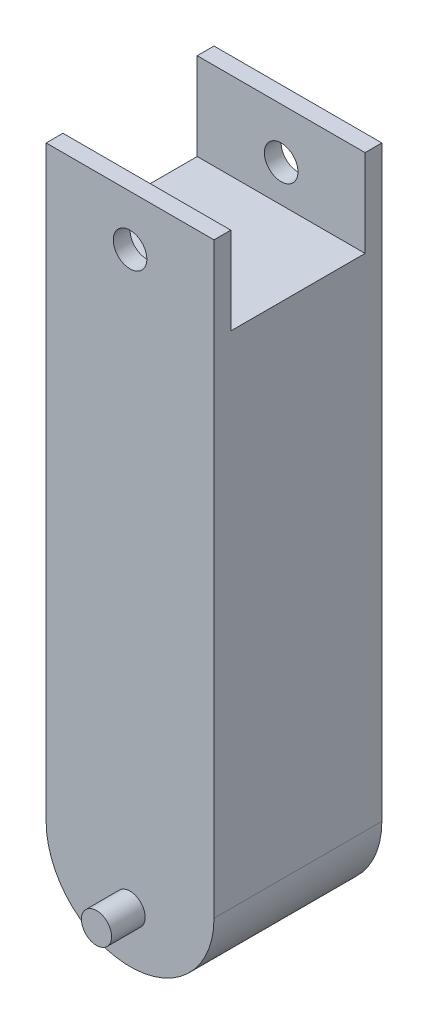
ISO-10303-21;
HEADER;
FILE_DESCRIPTION(('STEP AP214'),'2;1');
FILE_NAME('part.step','',(''),(''),'','','');
FILE_SCHEMA(('AUTOMOTIVE_DESIGN { 1 0 10303 214 1 1 1 1 }'));
ENDSEC;
DATA;
#1=APPLICATION_CONTEXT('core data for automotive mechanical design processes');
#2=APPLICATION_PROTOCOL_DEFINITION('international standard','automotive_design',2000,#1);
#3=PRODUCT_CONTEXT('',#1,'mechanical');
#4=PRODUCT('Part','Part','',(#3));
#5=PRODUCT_RELATED_PRODUCT_CATEGORY('part','',(#4));
#6=PRODUCT_DEFINITION_FORMATION('','',#4);
#7=PRODUCT_DEFINITION_CONTEXT('part definition',#1,'design');
#8=PRODUCT_DEFINITION('design','',#6,#7);
#9=PRODUCT_DEFINITION_SHAPE('','',#8);
#10=(LENGTH_UNIT() NAMED_UNIT(*) SI_UNIT(.MILLI.,.METRE.));
#11=(NAMED_UNIT(*) PLANE_ANGLE_UNIT() SI_UNIT($,.RADIAN.));
#12=(NAMED_UNIT(*) SI_UNIT($,.STERADIAN.) SOLID_ANGLE_UNIT());
#13=UNCERTAINTY_MEASURE_WITH_UNIT(LENGTH_MEASURE(1.E-05),#10,'distance_accuracy_value','');
#14=(GEOMETRIC_REPRESENTATION_CONTEXT(3) GLOBAL_UNCERTAINTY_ASSIGNED_CONTEXT((#13)) GLOBAL_UNIT_ASSIGNED_CONTEXT((#10,
#11,#12)) REPRESENTATION_CONTEXT('',''));
#15=CARTESIAN_POINT('',(0.,0.,0.));
#16=DIRECTION('',(0.,0.,1.));
#17=DIRECTION('',(1.,0.,0.));
#18=AXIS2_PLACEMENT_3D('',#15,#16,#17);
#19=CARTESIAN_POINT('',(0.,0.,63.5));
#20=DIRECTION('',(1.,0.,0.));
#21=DIRECTION('',(0.,0.,-1.));
#22=AXIS2_PLACEMENT_3D('',#19,#20,#21);
#23=PLANE('',#22);
#24=DIRECTION('',(0.,-1.,0.));
#25=VECTOR('',#24,1.);
#26=CARTESIAN_POINT('',(0.,0.,6.34999999999999));
#27=LINE('',#26,#25);
#28=CARTESIAN_POINT('',(0.,254.,6.34999999999999));
#29=VERTEX_POINT('',#28);
#30=CARTESIAN_POINT('',(0.,220.98,6.34999999999999));
#31=VERTEX_POINT('',#30);
#32=EDGE_CURVE('E112',#29,#31,#27,.T.);
#33=ORIENTED_EDGE('',*,*,#32,.F.);
#34=DIRECTION('',(0.,0.,-1.));
#35=VECTOR('',#34,1.);
#36=CARTESIAN_POINT('',(0.,254.,63.5));
#37=LINE('',#36,#35);
#38=CARTESIAN_POINT('',(0.,254.,0.));
#39=VERTEX_POINT('',#38);
#40=EDGE_CURVE('E152',#29,#39,#37,.T.);
#41=ORIENTED_EDGE('',*,*,#40,.T.);
#42=DIRECTION('',(0.,-1.,0.));
#43=VECTOR('',#42,1.);
#44=CARTESIAN_POINT('',(0.,0.,0.));
#45=LINE('',#44,#43);
#46=CARTESIAN_POINT('',(0.,31.75,0.));
#47=VERTEX_POINT('',#46);
#48=EDGE_CURVE('E143',#39,#47,#45,.T.);
#49=ORIENTED_EDGE('',*,*,#48,.T.);
#50=DIRECTION('',(0.,0.,-1.));
#51=VECTOR('',#50,1.);
#52=CARTESIAN_POINT('',(0.,31.75,63.5));
#53=LINE('',#52,#51);
#54=CARTESIAN_POINT('',(0.,31.75,63.5));
#55=VERTEX_POINT('',#54);
#56=EDGE_CURVE('E168',#47,#55,#53,.F.);
#57=ORIENTED_EDGE('',*,*,#56,.T.);
#58=DIRECTION('',(0.,-1.,0.));
#59=VECTOR('',#58,1.);
#60=CARTESIAN_POINT('',(0.,0.,63.5));
#61=LINE('',#60,#59);
#62=CARTESIAN_POINT('',(0.,254.,63.5));
#63=VERTEX_POINT('',#62);
#64=EDGE_CURVE('E144',#63,#55,#61,.T.);
#65=ORIENTED_EDGE('',*,*,#64,.F.);
#66=CARTESIAN_POINT('',(0.,254.,57.15));
#67=VERTEX_POINT('',#66);
#68=EDGE_CURVE('E121',#63,#67,#37,.T.);
#69=ORIENTED_EDGE('',*,*,#68,.T.);
#70=DIRECTION('',(0.,1.,0.));
#71=VECTOR('',#70,1.);
#72=CARTESIAN_POINT('',(0.,0.,57.1500000000001));
#73=LINE('',#72,#71);
#74=CARTESIAN_POINT('',(0.,220.98,57.15));
#75=VERTEX_POINT('',#74);
#76=EDGE_CURVE('E51',#75,#67,#73,.T.);
#77=ORIENTED_EDGE('',*,*,#76,.F.);
#78=DIRECTION('',(0.,0.,1.));
#79=VECTOR('',#78,1.);
#80=CARTESIAN_POINT('',(0.,220.98,63.5));
#81=LINE('',#80,#79);
#82=EDGE_CURVE('E103',#31,#75,#81,.T.);
#83=ORIENTED_EDGE('',*,*,#82,.F.);
#84=EDGE_LOOP('',(#33,#41,#49,#57,#65,#69,#77,#83));
#85=FACE_BOUND('',#84,.T.);
#86=ADVANCED_FACE('F35',(#85),#23,.F.);
#87=CARTESIAN_POINT('',(63.5,0.,63.5));
#88=DIRECTION('',(-1.,0.,0.));
#89=DIRECTION('',(0.,0.,1.));
#90=AXIS2_PLACEMENT_3D('',#87,#88,#89);
#91=PLANE('',#90);
#92=DIRECTION('',(0.,1.,0.));
#93=VECTOR('',#92,1.);
#94=CARTESIAN_POINT('',(63.5,0.,6.34999999999999));
#95=LINE('',#94,#93);
#96=CARTESIAN_POINT('',(63.5,220.98,6.34999999999999));
#97=VERTEX_POINT('',#96);
#98=CARTESIAN_POINT('',(63.5,254.,6.34999999999999));
#99=VERTEX_POINT('',#98);
#100=EDGE_CURVE('E131',#97,#99,#95,.T.);
#101=ORIENTED_EDGE('',*,*,#100,.F.);
#102=DIRECTION('',(0.,0.,-1.));
#103=VECTOR('',#102,1.);
#104=CARTESIAN_POINT('',(63.5,220.98,63.5));
#105=LINE('',#104,#103);
#106=CARTESIAN_POINT('',(63.5,220.98,57.15));
#107=VERTEX_POINT('',#106);
#108=EDGE_CURVE('E11',#107,#97,#105,.T.);
#109=ORIENTED_EDGE('',*,*,#108,.F.);
#110=DIRECTION('',(0.,-1.,0.));
#111=VECTOR('',#110,1.);
#112=CARTESIAN_POINT('',(63.5,0.,57.1500000000001));
#113=LINE('',#112,#111);
#114=CARTESIAN_POINT('',(63.5,254.,57.15));
#115=VERTEX_POINT('',#114);
#116=EDGE_CURVE('E116',#115,#107,#113,.T.);
#117=ORIENTED_EDGE('',*,*,#116,.F.);
#118=DIRECTION('',(0.,0.,-1.));
#119=VECTOR('',#118,1.);
#120=CARTESIAN_POINT('',(63.5,254.,63.5));
#121=LINE('',#120,#119);
#122=CARTESIAN_POINT('',(63.5,254.,63.5));
#123=VERTEX_POINT('',#122);
#124=EDGE_CURVE('E162',#123,#115,#121,.T.);
#125=ORIENTED_EDGE('',*,*,#124,.F.);
#126=DIRECTION('',(0.,1.,0.));
#127=VECTOR('',#126,1.);
#128=CARTESIAN_POINT('',(63.5,0.,63.5));
#129=LINE('',#128,#127);
#130=CARTESIAN_POINT('',(63.5,31.75,63.5));
#131=VERTEX_POINT('',#130);
#132=EDGE_CURVE('E147',#131,#123,#129,.T.);
#133=ORIENTED_EDGE('',*,*,#132,.F.);
#134=DIRECTION('',(0.,0.,-1.));
#135=VECTOR('',#134,1.);
#136=CARTESIAN_POINT('',(63.5,31.75,63.5));
#137=LINE('',#136,#135);
#138=CARTESIAN_POINT('',(63.5,31.75,0.));
#139=VERTEX_POINT('',#138);
#140=EDGE_CURVE('E165',#131,#139,#137,.T.);
#141=ORIENTED_EDGE('',*,*,#140,.T.);
#142=DIRECTION('',(0.,1.,0.));
#143=VECTOR('',#142,1.);
#144=CARTESIAN_POINT('',(63.5,0.,0.));
#145=LINE('',#144,#143);
#146=CARTESIAN_POINT('',(63.5,254.,0.));
#147=VERTEX_POINT('',#146);
#148=EDGE_CURVE('E155',#139,#147,#145,.T.);
#149=ORIENTED_EDGE('',*,*,#148,.T.);
#150=EDGE_CURVE('E161',#99,#147,#121,.T.);
#151=ORIENTED_EDGE('',*,*,#150,.F.);
#152=EDGE_LOOP('',(#101,#109,#117,#125,#133,#141,#149,#151));
#153=FACE_BOUND('',#152,.T.);
#154=ADVANCED_FACE('F191',(#153),#91,.F.);
#155=CARTESIAN_POINT('',(0.,254.,63.5));
#156=DIRECTION('',(0.,-1.,0.));
#157=DIRECTION('',(0.,0.,-1.));
#158=AXIS2_PLACEMENT_3D('',#155,#156,#157);
#159=PLANE('',#158);
#160=DIRECTION('',(-1.,0.,0.));
#161=VECTOR('',#160,1.);
#162=CARTESIAN_POINT('',(0.,254.,6.34999999999999));
#163=LINE('',#162,#161);
#164=EDGE_CURVE('E125',#99,#29,#163,.T.);
#165=ORIENTED_EDGE('',*,*,#164,.F.);
#166=ORIENTED_EDGE('',*,*,#150,.T.);
#167=DIRECTION('',(-1.,0.,0.));
#168=VECTOR('',#167,1.);
#169=CARTESIAN_POINT('',(0.,254.,0.));
#170=LINE('',#169,#168);
#171=EDGE_CURVE('E148',#147,#39,#170,.T.);
#172=ORIENTED_EDGE('',*,*,#171,.T.);
#173=ORIENTED_EDGE('',*,*,#40,.F.);
#174=EDGE_LOOP('',(#165,#166,#172,#173));
#175=FACE_BOUND('',#174,.T.);
#176=ADVANCED_FACE('F195',(#175),#159,.F.);
#177=DIRECTION('',(1.,0.,0.));
#178=VECTOR('',#177,1.);
#179=CARTESIAN_POINT('',(0.,254.,57.15));
#180=LINE('',#179,#178);
#181=EDGE_CURVE('E126',#67,#115,#180,.T.);
#182=ORIENTED_EDGE('',*,*,#181,.F.);
#183=ORIENTED_EDGE('',*,*,#68,.F.);
#184=DIRECTION('',(-1.,0.,0.));
#185=VECTOR('',#184,1.);
#186=CARTESIAN_POINT('',(0.,254.,63.5));
#187=LINE('',#186,#185);
#188=EDGE_CURVE('E150',#123,#63,#187,.T.);
#189=ORIENTED_EDGE('',*,*,#188,.F.);
#190=ORIENTED_EDGE('',*,*,#124,.T.);
#191=EDGE_LOOP('',(#182,#183,#189,#190));
#192=FACE_BOUND('',#191,.T.);
#193=ADVANCED_FACE('F221',(#192),#159,.F.);
#194=CARTESIAN_POINT('',(31.75,234.95,116.586));
#195=DIRECTION('',(0.,0.,-1.));
#196=DIRECTION('',(-1.,0.,0.));
#197=AXIS2_PLACEMENT_3D('',#194,#195,#196);
#198=CYLINDRICAL_SURFACE('',#197,6.35);
#199=CARTESIAN_POINT('',(31.75,234.95,0.));
#200=DIRECTION('',(0.,0.,-1.));
#201=DIRECTION('',(-1.,0.,0.));
#202=AXIS2_PLACEMENT_3D('',#199,#200,#201);
#203=CIRCLE('',#202,6.35);
#204=CARTESIAN_POINT('',(25.4,234.95,0.));
#205=VERTEX_POINT('',#204);
#206=EDGE_CURVE('E111',#205,#205,#203,.F.);
#207=ORIENTED_EDGE('',*,*,#206,.F.);
#208=EDGE_LOOP('',(#207));
#209=FACE_BOUND('',#208,.T.);
#210=CARTESIAN_POINT('',(31.75,234.95,6.34999999999999));
#211=DIRECTION('',(0.,0.,1.));
#212=DIRECTION('',(1.,0.,0.));
#213=AXIS2_PLACEMENT_3D('',#210,#211,#212);
#214=CIRCLE('',#213,6.35);
#215=CARTESIAN_POINT('',(38.1,234.95,6.34999999999999));
#216=VERTEX_POINT('',#215);
#217=EDGE_CURVE('E122',#216,#216,#214,.T.);
#218=ORIENTED_EDGE('',*,*,#217,.T.);
#219=EDGE_LOOP('',(#218));
#220=FACE_BOUND('',#219,.T.);
#221=ADVANCED_FACE('F210',(#209,#220),#198,.F.);
#222=CARTESIAN_POINT('',(31.75,234.95,63.5));
#223=DIRECTION('',(0.,0.,-1.));
#224=DIRECTION('',(-1.,0.,0.));
#225=AXIS2_PLACEMENT_3D('',#222,#223,#224);
#226=CIRCLE('',#225,6.35);
#227=CARTESIAN_POINT('',(25.4,234.95,63.5));
#228=VERTEX_POINT('',#227);
#229=EDGE_CURVE('E134',#228,#228,#226,.F.);
#230=ORIENTED_EDGE('',*,*,#229,.T.);
#231=EDGE_LOOP('',(#230));
#232=FACE_BOUND('',#231,.T.);
#233=CARTESIAN_POINT('',(31.75,234.95,57.15));
#234=DIRECTION('',(0.,0.,-1.));
#235=DIRECTION('',(0.,1.,0.));
#236=AXIS2_PLACEMENT_3D('',#233,#234,#235);
#237=CIRCLE('',#236,6.35);
#238=CARTESIAN_POINT('',(31.75,241.3,57.15));
#239=VERTEX_POINT('',#238);
#240=EDGE_CURVE('E180',#239,#239,#237,.T.);
#241=ORIENTED_EDGE('',*,*,#240,.T.);
#242=EDGE_LOOP('',(#241));
#243=FACE_BOUND('',#242,.T.);
#244=ADVANCED_FACE('F203',(#232,#243),#198,.F.);
#245=CARTESIAN_POINT('',(31.75,31.75,63.5));
#246=DIRECTION('',(0.,0.,-1.));
#247=DIRECTION('',(-1.,0.,0.));
#248=AXIS2_PLACEMENT_3D('',#245,#246,#247);
#249=CYLINDRICAL_SURFACE('',#248,31.75);
#250=ORIENTED_EDGE('',*,*,#140,.F.);
#251=CARTESIAN_POINT('',(31.75,31.75,63.5));
#252=DIRECTION('',(0.,0.,-1.));
#253=DIRECTION('',(-1.,0.,0.));
#254=AXIS2_PLACEMENT_3D('',#251,#252,#253);
#255=CIRCLE('',#254,31.75);
#256=EDGE_CURVE('E59',#55,#131,#255,.F.);
#257=ORIENTED_EDGE('',*,*,#256,.F.);
#258=ORIENTED_EDGE('',*,*,#56,.F.);
#259=CARTESIAN_POINT('',(31.75,31.75,0.));
#260=DIRECTION('',(0.,0.,-1.));
#261=DIRECTION('',(-1.,0.,0.));
#262=AXIS2_PLACEMENT_3D('',#259,#260,#261);
#263=CIRCLE('',#262,31.75);
#264=EDGE_CURVE('E171',#139,#47,#263,.T.);
#265=ORIENTED_EDGE('',*,*,#264,.F.);
#266=EDGE_LOOP('',(#250,#257,#258,#265));
#267=FACE_BOUND('',#266,.T.);
#268=ADVANCED_FACE('F38',(#267),#249,.T.);
#269=CARTESIAN_POINT('',(0.,0.,63.5));
#270=DIRECTION('',(0.,0.,-1.));
#271=DIRECTION('',(-1.,0.,0.));
#272=AXIS2_PLACEMENT_3D('',#269,#270,#271);
#273=PLANE('',#272);
#274=ORIENTED_EDGE('',*,*,#229,.F.);
#275=EDGE_LOOP('',(#274));
#276=FACE_BOUND('',#275,.T.);
#277=CARTESIAN_POINT('',(31.75,19.05,63.5));
#278=DIRECTION('',(0.,0.,-1.));
#279=DIRECTION('',(-1.,0.,0.));
#280=AXIS2_PLACEMENT_3D('',#277,#278,#279);
#281=CIRCLE('',#280,5.715);
#282=CARTESIAN_POINT('',(26.035,19.05,63.5));
#283=VERTEX_POINT('',#282);
#284=EDGE_CURVE('E173',#283,#283,#281,.F.);
#285=ORIENTED_EDGE('',*,*,#284,.F.);
#286=EDGE_LOOP('',(#285));
#287=FACE_BOUND('',#286,.T.);
#288=ORIENTED_EDGE('',*,*,#64,.T.);
#289=ORIENTED_EDGE('',*,*,#256,.T.);
#290=ORIENTED_EDGE('',*,*,#132,.T.);
#291=ORIENTED_EDGE('',*,*,#188,.T.);
#292=EDGE_LOOP('',(#288,#289,#290,#291));
#293=FACE_BOUND('',#292,.T.);
#294=ADVANCED_FACE('F202',(#276,#287,#293),#273,.F.);
#295=CARTESIAN_POINT('',(0.,0.,0.));
#296=DIRECTION('',(0.,0.,-1.));
#297=DIRECTION('',(-1.,0.,0.));
#298=AXIS2_PLACEMENT_3D('',#295,#296,#297);
#299=PLANE('',#298);
#300=ORIENTED_EDGE('',*,*,#206,.T.);
#301=EDGE_LOOP('',(#300));
#302=FACE_BOUND('',#301,.T.);
#303=CARTESIAN_POINT('',(31.75,19.05,0.));
#304=DIRECTION('',(0.,0.,-1.));
#305=DIRECTION('',(-1.,0.,0.));
#306=AXIS2_PLACEMENT_3D('',#303,#304,#305);
#307=CIRCLE('',#306,5.715);
#308=CARTESIAN_POINT('',(26.035,19.05,0.));
#309=VERTEX_POINT('',#308);
#310=EDGE_CURVE('E44',#309,#309,#307,.T.);
#311=ORIENTED_EDGE('',*,*,#310,.F.);
#312=EDGE_LOOP('',(#311));
#313=FACE_BOUND('',#312,.T.);
#314=ORIENTED_EDGE('',*,*,#148,.F.);
#315=ORIENTED_EDGE('',*,*,#264,.T.);
#316=ORIENTED_EDGE('',*,*,#48,.F.);
#317=ORIENTED_EDGE('',*,*,#171,.F.);
#318=EDGE_LOOP('',(#314,#315,#316,#317));
#319=FACE_BOUND('',#318,.T.);
#320=ADVANCED_FACE('F199',(#302,#313,#319),#299,.T.);
#321=CARTESIAN_POINT('',(31.75,19.05,76.2));
#322=DIRECTION('',(0.,0.,-1.));
#323=DIRECTION('',(-1.,0.,0.));
#324=AXIS2_PLACEMENT_3D('',#321,#322,#323);
#325=CYLINDRICAL_SURFACE('',#324,5.715);
#326=CARTESIAN_POINT('',(31.75,19.05,76.2));
#327=DIRECTION('',(0.,0.,1.));
#328=DIRECTION('',(1.,0.,0.));
#329=AXIS2_PLACEMENT_3D('',#326,#327,#328);
#330=CIRCLE('',#329,5.715);
#331=CARTESIAN_POINT('',(37.465,19.05,76.2));
#332=VERTEX_POINT('',#331);
#333=EDGE_CURVE('E140',#332,#332,#330,.T.);
#334=ORIENTED_EDGE('',*,*,#333,.F.);
#335=EDGE_LOOP('',(#334));
#336=FACE_BOUND('',#335,.T.);
#337=ORIENTED_EDGE('',*,*,#284,.T.);
#338=EDGE_LOOP('',(#337));
#339=FACE_BOUND('',#338,.T.);
#340=ADVANCED_FACE('F223',(#336,#339),#325,.T.);
#341=CARTESIAN_POINT('',(31.75,19.05,76.2));
#342=DIRECTION('',(0.,0.,1.));
#343=DIRECTION('',(1.,0.,0.));
#344=AXIS2_PLACEMENT_3D('',#341,#342,#343);
#345=PLANE('',#344);
#346=ORIENTED_EDGE('',*,*,#333,.T.);
#347=EDGE_LOOP('',(#346));
#348=FACE_BOUND('',#347,.T.);
#349=ADVANCED_FACE('F228',(#348),#345,.T.);
#350=CARTESIAN_POINT('',(31.75,19.05,-12.7));
#351=DIRECTION('',(0.,0.,1.));
#352=DIRECTION('',(1.,0.,0.));
#353=AXIS2_PLACEMENT_3D('',#350,#351,#352);
#354=CYLINDRICAL_SURFACE('',#353,5.715);
#355=CARTESIAN_POINT('',(31.75,19.05,-12.7));
#356=DIRECTION('',(0.,0.,1.));
#357=DIRECTION('',(1.,0.,0.));
#358=AXIS2_PLACEMENT_3D('',#355,#356,#357);
#359=CIRCLE('',#358,5.715);
#360=CARTESIAN_POINT('',(37.465,19.05,-12.7));
#361=VERTEX_POINT('',#360);
#362=EDGE_CURVE('E137',#361,#361,#359,.T.);
#363=ORIENTED_EDGE('',*,*,#362,.T.);
#364=EDGE_LOOP('',(#363));
#365=FACE_BOUND('',#364,.T.);
#366=ORIENTED_EDGE('',*,*,#310,.T.);
#367=EDGE_LOOP('',(#366));
#368=FACE_BOUND('',#367,.T.);
#369=ADVANCED_FACE('F232',(#365,#368),#354,.T.);
#370=CARTESIAN_POINT('',(31.75,19.05,-12.7));
#371=DIRECTION('',(0.,0.,-1.));
#372=DIRECTION('',(1.,0.,0.));
#373=AXIS2_PLACEMENT_3D('',#370,#371,#372);
#374=PLANE('',#373);
#375=ORIENTED_EDGE('',*,*,#362,.F.);
#376=EDGE_LOOP('',(#375));
#377=FACE_BOUND('',#376,.T.);
#378=ADVANCED_FACE('F236',(#377),#374,.T.);
#379=CARTESIAN_POINT('',(-69.596,220.98,6.34999999999999));
#380=DIRECTION('',(0.,1.,0.));
#381=DIRECTION('',(0.,0.,1.));
#382=AXIS2_PLACEMENT_3D('',#379,#380,#381);
#383=PLANE('',#382);
#384=ORIENTED_EDGE('',*,*,#82,.T.);
#385=DIRECTION('',(1.,0.,0.));
#386=VECTOR('',#385,1.);
#387=CARTESIAN_POINT('',(-69.596,220.98,57.15));
#388=LINE('',#387,#386);
#389=EDGE_CURVE('E105',#75,#107,#388,.T.);
#390=ORIENTED_EDGE('',*,*,#389,.T.);
#391=ORIENTED_EDGE('',*,*,#108,.T.);
#392=DIRECTION('',(1.,0.,0.));
#393=VECTOR('',#392,1.);
#394=CARTESIAN_POINT('',(-69.596,220.98,6.34999999999999));
#395=LINE('',#394,#393);
#396=EDGE_CURVE('E108',#31,#97,#395,.T.);
#397=ORIENTED_EDGE('',*,*,#396,.F.);
#398=EDGE_LOOP('',(#384,#390,#391,#397));
#399=FACE_BOUND('',#398,.T.);
#400=ADVANCED_FACE('F104',(#399),#383,.T.);
#401=CARTESIAN_POINT('',(-69.596,220.98,6.34999999999999));
#402=DIRECTION('',(0.,0.,1.));
#403=DIRECTION('',(1.,0.,0.));
#404=AXIS2_PLACEMENT_3D('',#401,#402,#403);
#405=PLANE('',#404);
#406=ORIENTED_EDGE('',*,*,#217,.F.);
#407=EDGE_LOOP('',(#406));
#408=FACE_BOUND('',#407,.T.);
#409=ORIENTED_EDGE('',*,*,#32,.T.);
#410=ORIENTED_EDGE('',*,*,#396,.T.);
#411=ORIENTED_EDGE('',*,*,#100,.T.);
#412=ORIENTED_EDGE('',*,*,#164,.T.);
#413=EDGE_LOOP('',(#409,#410,#411,#412));
#414=FACE_BOUND('',#413,.T.);
#415=ADVANCED_FACE('F187',(#408,#414),#405,.T.);
#416=CARTESIAN_POINT('',(-69.596,220.98,57.15));
#417=DIRECTION('',(0.,0.,-1.));
#418=DIRECTION('',(0.,1.,0.));
#419=AXIS2_PLACEMENT_3D('',#416,#417,#418);
#420=PLANE('',#419);
#421=ORIENTED_EDGE('',*,*,#240,.F.);
#422=EDGE_LOOP('',(#421));
#423=FACE_BOUND('',#422,.T.);
#424=ORIENTED_EDGE('',*,*,#76,.T.);
#425=ORIENTED_EDGE('',*,*,#181,.T.);
#426=ORIENTED_EDGE('',*,*,#116,.T.);
#427=ORIENTED_EDGE('',*,*,#389,.F.);
#428=EDGE_LOOP('',(#424,#425,#426,#427));
#429=FACE_BOUND('',#428,.T.);
#430=ADVANCED_FACE('F114',(#423,#429),#420,.T.);
#431=CLOSED_SHELL('',(#86,#154,#176,#193,#221,#244,#268,#294,#320,#340,#349,#369,#378,#400,#415,#430));
#432=MANIFOLD_SOLID_BREP('B2',#431);
#433=ADVANCED_BREP_SHAPE_REPRESENTATION('',(#18,#432),#14);
#434=SHAPE_DEFINITION_REPRESENTATION(#9,#433);
ENDSEC;
END-ISO-10303-21;
